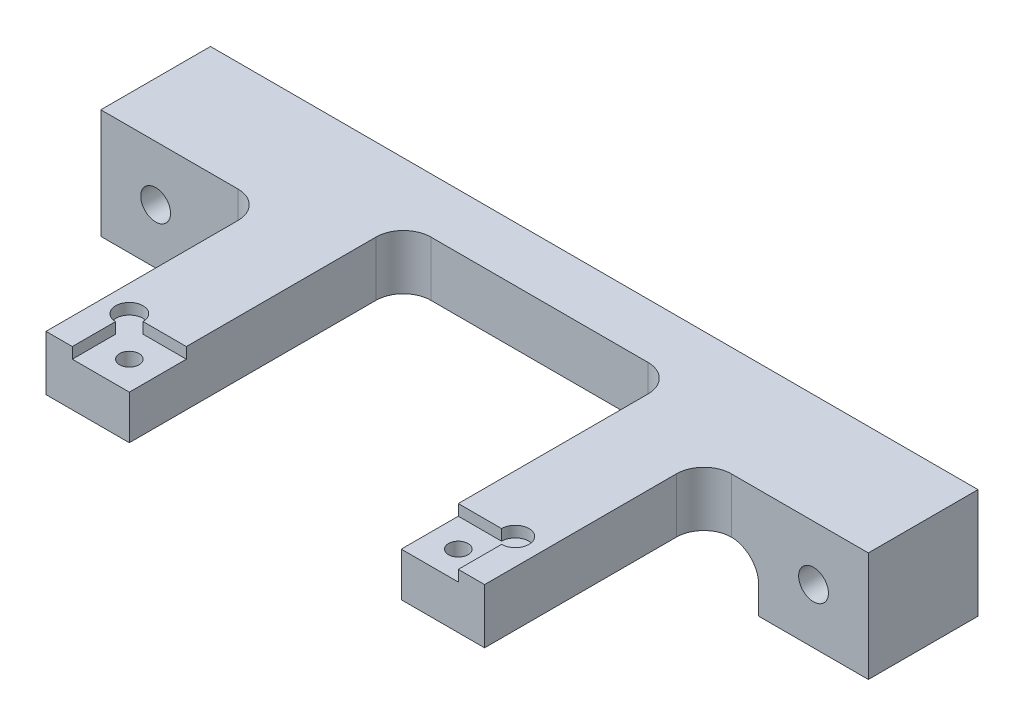
ISO-10303-21;
HEADER;
FILE_DESCRIPTION(('STEP AP214'),'2;1');
FILE_NAME('part.step','',(''),(''),'','','');
FILE_SCHEMA(('AUTOMOTIVE_DESIGN { 1 0 10303 214 1 1 1 1 }'));
ENDSEC;
DATA;
#1=APPLICATION_CONTEXT('core data for automotive mechanical design processes');
#2=APPLICATION_PROTOCOL_DEFINITION('international standard','automotive_design',2000,#1);
#3=PRODUCT_CONTEXT('',#1,'mechanical');
#4=PRODUCT('Part','Part','',(#3));
#5=PRODUCT_RELATED_PRODUCT_CATEGORY('part','',(#4));
#6=PRODUCT_DEFINITION_FORMATION('','',#4);
#7=PRODUCT_DEFINITION_CONTEXT('part definition',#1,'design');
#8=PRODUCT_DEFINITION('design','',#6,#7);
#9=PRODUCT_DEFINITION_SHAPE('','',#8);
#10=(LENGTH_UNIT() NAMED_UNIT(*) SI_UNIT(.MILLI.,.METRE.));
#11=(NAMED_UNIT(*) PLANE_ANGLE_UNIT() SI_UNIT($,.RADIAN.));
#12=(NAMED_UNIT(*) SI_UNIT($,.STERADIAN.) SOLID_ANGLE_UNIT());
#13=UNCERTAINTY_MEASURE_WITH_UNIT(LENGTH_MEASURE(1.E-05),#10,'distance_accuracy_value','');
#14=(GEOMETRIC_REPRESENTATION_CONTEXT(3) GLOBAL_UNCERTAINTY_ASSIGNED_CONTEXT((#13)) GLOBAL_UNIT_ASSIGNED_CONTEXT((#10,
#11,#12)) REPRESENTATION_CONTEXT('',''));
#15=CARTESIAN_POINT('',(0.,0.,0.));
#16=DIRECTION('',(0.,0.,1.));
#17=DIRECTION('',(1.,0.,0.));
#18=AXIS2_PLACEMENT_3D('',#15,#16,#17);
#19=CARTESIAN_POINT('',(-44.45,-12.7,19.05));
#20=DIRECTION('',(0.,0.,1.));
#21=DIRECTION('',(1.,0.,0.));
#22=AXIS2_PLACEMENT_3D('',#19,#20,#21);
#23=PLANE('',#22);
#24=DIRECTION('',(0.,1.,0.));
#25=VECTOR('',#24,1.);
#26=CARTESIAN_POINT('',(-22.352,-1.27,19.05));
#27=LINE('',#26,#25);
#28=CARTESIAN_POINT('',(-22.352,-1.27,19.05));
#29=VERTEX_POINT('',#28);
#30=CARTESIAN_POINT('',(-22.352,0.,19.05));
#31=VERTEX_POINT('',#30);
#32=EDGE_CURVE('E502',#29,#31,#27,.T.);
#33=ORIENTED_EDGE('',*,*,#32,.T.);
#34=DIRECTION('',(1.,0.,0.));
#35=VECTOR('',#34,1.);
#36=CARTESIAN_POINT('',(-44.45,0.,19.05));
#37=LINE('',#36,#35);
#38=CARTESIAN_POINT('',(-25.4,0.,19.05));
#39=VERTEX_POINT('',#38);
#40=EDGE_CURVE('E268',#39,#31,#37,.T.);
#41=ORIENTED_EDGE('',*,*,#40,.F.);
#42=DIRECTION('',(0.,1.,0.));
#43=VECTOR('',#42,1.);
#44=CARTESIAN_POINT('',(-25.4,-12.7,19.05));
#45=LINE('',#44,#43);
#46=CARTESIAN_POINT('',(-25.4,-6.35,19.05));
#47=VERTEX_POINT('',#46);
#48=EDGE_CURVE('E371',#47,#39,#45,.T.);
#49=ORIENTED_EDGE('',*,*,#48,.F.);
#50=DIRECTION('',(-1.,0.,0.));
#51=VECTOR('',#50,1.);
#52=CARTESIAN_POINT('',(-25.4,-6.35,19.05));
#53=LINE('',#52,#51);
#54=CARTESIAN_POINT('',(-15.748,-6.35,19.05));
#55=VERTEX_POINT('',#54);
#56=EDGE_CURVE('E510',#55,#47,#53,.T.);
#57=ORIENTED_EDGE('',*,*,#56,.F.);
#58=DIRECTION('',(0.,1.,0.));
#59=VECTOR('',#58,1.);
#60=CARTESIAN_POINT('',(-15.748,-12.7,19.05));
#61=LINE('',#60,#59);
#62=CARTESIAN_POINT('',(-15.748,-1.27,19.05));
#63=VERTEX_POINT('',#62);
#64=EDGE_CURVE('E526',#55,#63,#61,.T.);
#65=ORIENTED_EDGE('',*,*,#64,.T.);
#66=DIRECTION('',(1.,0.,0.));
#67=VECTOR('',#66,1.);
#68=CARTESIAN_POINT('',(-15.748,-1.27,19.05));
#69=LINE('',#68,#67);
#70=EDGE_CURVE('E496',#29,#63,#69,.T.);
#71=ORIENTED_EDGE('',*,*,#70,.F.);
#72=EDGE_LOOP('',(#33,#41,#49,#57,#65,#71));
#73=FACE_BOUND('',#72,.T.);
#74=ADVANCED_FACE('F39',(#73),#23,.T.);
#75=DIRECTION('',(0.,1.,0.));
#76=VECTOR('',#75,1.);
#77=CARTESIAN_POINT('',(22.352,-1.27,19.05));
#78=LINE('',#77,#76);
#79=CARTESIAN_POINT('',(22.352,-1.27,19.05));
#80=VERTEX_POINT('',#79);
#81=CARTESIAN_POINT('',(22.352,0.,19.05));
#82=VERTEX_POINT('',#81);
#83=EDGE_CURVE('E478',#80,#82,#78,.T.);
#84=ORIENTED_EDGE('',*,*,#83,.F.);
#85=DIRECTION('',(1.,0.,0.));
#86=VECTOR('',#85,1.);
#87=CARTESIAN_POINT('',(15.748,-1.27,19.05));
#88=LINE('',#87,#86);
#89=CARTESIAN_POINT('',(15.748,-1.27,19.05));
#90=VERTEX_POINT('',#89);
#91=EDGE_CURVE('E469',#90,#80,#88,.T.);
#92=ORIENTED_EDGE('',*,*,#91,.F.);
#93=DIRECTION('',(0.,1.,0.));
#94=VECTOR('',#93,1.);
#95=CARTESIAN_POINT('',(15.748,-12.7,19.05));
#96=LINE('',#95,#94);
#97=CARTESIAN_POINT('',(15.748,-6.35,19.05));
#98=VERTEX_POINT('',#97);
#99=EDGE_CURVE('E362',#98,#90,#96,.T.);
#100=ORIENTED_EDGE('',*,*,#99,.F.);
#101=CARTESIAN_POINT('',(25.4,-6.35,19.05));
#102=VERTEX_POINT('',#101);
#103=EDGE_CURVE('E511',#102,#98,#53,.T.);
#104=ORIENTED_EDGE('',*,*,#103,.F.);
#105=DIRECTION('',(0.,1.,0.));
#106=VECTOR('',#105,1.);
#107=CARTESIAN_POINT('',(25.4,-12.7,19.05));
#108=LINE('',#107,#106);
#109=CARTESIAN_POINT('',(25.4,0.,19.05));
#110=VERTEX_POINT('',#109);
#111=EDGE_CURVE('E365',#102,#110,#108,.T.);
#112=ORIENTED_EDGE('',*,*,#111,.T.);
#113=EDGE_CURVE('E266',#82,#110,#37,.T.);
#114=ORIENTED_EDGE('',*,*,#113,.F.);
#115=EDGE_LOOP('',(#84,#92,#100,#104,#112,#114));
#116=FACE_BOUND('',#115,.T.);
#117=ADVANCED_FACE('F570',(#116),#23,.T.);
#118=CARTESIAN_POINT('',(0.,-12.7,0.));
#119=DIRECTION('',(0.,1.,0.));
#120=DIRECTION('',(0.,0.,1.));
#121=AXIS2_PLACEMENT_3D('',#118,#119,#120);
#122=PLANE('',#121);
#123=DIRECTION('',(-1.,0.,0.));
#124=VECTOR('',#123,1.);
#125=CARTESIAN_POINT('',(-44.45,-12.7,-19.05));
#126=LINE('',#125,#124);
#127=CARTESIAN_POINT('',(-31.75,-12.7,-19.05));
#128=VERTEX_POINT('',#127);
#129=CARTESIAN_POINT('',(-44.45,-12.7,-19.05));
#130=VERTEX_POINT('',#129);
#131=EDGE_CURVE('E255',#128,#130,#126,.T.);
#132=ORIENTED_EDGE('',*,*,#131,.F.);
#133=DIRECTION('',(0.,0.,-1.));
#134=VECTOR('',#133,1.);
#135=CARTESIAN_POINT('',(-31.75,-12.7,-19.05));
#136=LINE('',#135,#134);
#137=CARTESIAN_POINT('',(-31.75,-12.7,-6.35));
#138=VERTEX_POINT('',#137);
#139=EDGE_CURVE('E420',#138,#128,#136,.T.);
#140=ORIENTED_EDGE('',*,*,#139,.F.);
#141=DIRECTION('',(-1.,0.,0.));
#142=VECTOR('',#141,1.);
#143=CARTESIAN_POINT('',(-44.45,-12.7,-6.35000000000001));
#144=LINE('',#143,#142);
#145=CARTESIAN_POINT('',(-44.45,-12.7,-6.35000000000001));
#146=VERTEX_POINT('',#145);
#147=EDGE_CURVE('E369',#138,#146,#144,.T.);
#148=ORIENTED_EDGE('',*,*,#147,.T.);
#149=DIRECTION('',(0.,0.,1.));
#150=VECTOR('',#149,1.);
#151=CARTESIAN_POINT('',(-44.45,-12.7,-19.05));
#152=LINE('',#151,#150);
#153=EDGE_CURVE('E276',#130,#146,#152,.T.);
#154=ORIENTED_EDGE('',*,*,#153,.F.);
#155=EDGE_LOOP('',(#132,#140,#148,#154));
#156=FACE_BOUND('',#155,.T.);
#157=ADVANCED_FACE('F575',(#156),#122,.F.);
#158=CARTESIAN_POINT('',(-25.4,-12.7,19.05));
#159=DIRECTION('',(1.,0.,0.));
#160=DIRECTION('',(0.,0.,-1.));
#161=AXIS2_PLACEMENT_3D('',#158,#159,#160);
#162=PLANE('',#161);
#163=DIRECTION('',(0.,0.,-1.));
#164=VECTOR('',#163,1.);
#165=CARTESIAN_POINT('',(-25.4,0.,19.05));
#166=LINE('',#165,#164);
#167=CARTESIAN_POINT('',(-25.4,0.,-3.17500000000001));
#168=VERTEX_POINT('',#167);
#169=EDGE_CURVE('E367',#39,#168,#166,.T.);
#170=ORIENTED_EDGE('',*,*,#169,.T.);
#171=DIRECTION('',(0.,1.,0.));
#172=VECTOR('',#171,1.);
#173=CARTESIAN_POINT('',(-25.4,-6.35,-3.17500000000001));
#174=LINE('',#173,#172);
#175=CARTESIAN_POINT('',(-25.4,-6.35,-3.175));
#176=VERTEX_POINT('',#175);
#177=EDGE_CURVE('E325',#168,#176,#174,.F.);
#178=ORIENTED_EDGE('',*,*,#177,.T.);
#179=DIRECTION('',(0.,0.,-1.));
#180=VECTOR('',#179,1.);
#181=CARTESIAN_POINT('',(-25.4,-6.35,19.05));
#182=LINE('',#181,#180);
#183=EDGE_CURVE('E408',#47,#176,#182,.T.);
#184=ORIENTED_EDGE('',*,*,#183,.F.);
#185=ORIENTED_EDGE('',*,*,#48,.T.);
#186=EDGE_LOOP('',(#170,#178,#184,#185));
#187=FACE_BOUND('',#186,.T.);
#188=ADVANCED_FACE('F401',(#187),#162,.F.);
#189=CARTESIAN_POINT('',(25.4,-12.7,19.05));
#190=DIRECTION('',(-1.,0.,0.));
#191=DIRECTION('',(0.,0.,1.));
#192=AXIS2_PLACEMENT_3D('',#189,#190,#191);
#193=PLANE('',#192);
#194=DIRECTION('',(0.,0.,1.));
#195=VECTOR('',#194,1.);
#196=CARTESIAN_POINT('',(25.4,-6.35,19.05));
#197=LINE('',#196,#195);
#198=CARTESIAN_POINT('',(25.4,-6.35,-3.175));
#199=VERTEX_POINT('',#198);
#200=EDGE_CURVE('E353',#199,#102,#197,.T.);
#201=ORIENTED_EDGE('',*,*,#200,.F.);
#202=DIRECTION('',(0.,1.,0.));
#203=VECTOR('',#202,1.);
#204=CARTESIAN_POINT('',(25.4,0.,-3.175));
#205=LINE('',#204,#203);
#206=CARTESIAN_POINT('',(25.4,0.,-3.175));
#207=VERTEX_POINT('',#206);
#208=EDGE_CURVE('E331',#199,#207,#205,.T.);
#209=ORIENTED_EDGE('',*,*,#208,.T.);
#210=DIRECTION('',(0.,0.,1.));
#211=VECTOR('',#210,1.);
#212=CARTESIAN_POINT('',(25.4,0.,19.05));
#213=LINE('',#212,#211);
#214=EDGE_CURVE('E351',#207,#110,#213,.T.);
#215=ORIENTED_EDGE('',*,*,#214,.T.);
#216=ORIENTED_EDGE('',*,*,#111,.F.);
#217=EDGE_LOOP('',(#201,#209,#215,#216));
#218=FACE_BOUND('',#217,.T.);
#219=ADVANCED_FACE('F349',(#218),#193,.F.);
#220=CARTESIAN_POINT('',(-15.748,-12.7,-12.7));
#221=DIRECTION('',(-1.,0.,0.));
#222=DIRECTION('',(0.,0.,1.));
#223=AXIS2_PLACEMENT_3D('',#220,#221,#222);
#224=PLANE('',#223);
#225=DIRECTION('',(0.,0.,1.));
#226=VECTOR('',#225,1.);
#227=CARTESIAN_POINT('',(-15.748,-6.35,-12.7));
#228=LINE('',#227,#226);
#229=CARTESIAN_POINT('',(-15.748,-6.35,-9.52500000000001));
#230=VERTEX_POINT('',#229);
#231=EDGE_CURVE('E516',#230,#55,#228,.T.);
#232=ORIENTED_EDGE('',*,*,#231,.F.);
#233=DIRECTION('',(0.,1.,0.));
#234=VECTOR('',#233,1.);
#235=CARTESIAN_POINT('',(-15.748,0.,-9.52500000000001));
#236=LINE('',#235,#234);
#237=CARTESIAN_POINT('',(-15.748,0.,-9.52500000000001));
#238=VERTEX_POINT('',#237);
#239=EDGE_CURVE('E281',#230,#238,#236,.T.);
#240=ORIENTED_EDGE('',*,*,#239,.T.);
#241=DIRECTION('',(0.,0.,1.));
#242=VECTOR('',#241,1.);
#243=CARTESIAN_POINT('',(-15.748,0.,-12.7));
#244=LINE('',#243,#242);
#245=CARTESIAN_POINT('',(-15.748,0.,12.446));
#246=VERTEX_POINT('',#245);
#247=EDGE_CURVE('E518',#238,#246,#244,.T.);
#248=ORIENTED_EDGE('',*,*,#247,.T.);
#249=DIRECTION('',(0.,1.,0.));
#250=VECTOR('',#249,1.);
#251=CARTESIAN_POINT('',(-15.748,-1.27,12.446));
#252=LINE('',#251,#250);
#253=CARTESIAN_POINT('',(-15.748,-1.27,12.446));
#254=VERTEX_POINT('',#253);
#255=EDGE_CURVE('E498',#254,#246,#252,.T.);
#256=ORIENTED_EDGE('',*,*,#255,.F.);
#257=DIRECTION('',(0.,0.,-1.));
#258=VECTOR('',#257,1.);
#259=CARTESIAN_POINT('',(-15.748,-1.27,19.05));
#260=LINE('',#259,#258);
#261=EDGE_CURVE('E487',#63,#254,#260,.T.);
#262=ORIENTED_EDGE('',*,*,#261,.F.);
#263=ORIENTED_EDGE('',*,*,#64,.F.);
#264=EDGE_LOOP('',(#232,#240,#248,#256,#262,#263));
#265=FACE_BOUND('',#264,.T.);
#266=ADVANCED_FACE('F537',(#265),#224,.F.);
#267=CARTESIAN_POINT('',(-15.748,-12.7,-12.7));
#268=DIRECTION('',(0.,0.,-1.));
#269=DIRECTION('',(-1.,0.,0.));
#270=AXIS2_PLACEMENT_3D('',#267,#268,#269);
#271=PLANE('',#270);
#272=DIRECTION('',(-1.,0.,0.));
#273=VECTOR('',#272,1.);
#274=CARTESIAN_POINT('',(-15.748,0.,-12.7));
#275=LINE('',#274,#273);
#276=CARTESIAN_POINT('',(12.573,0.,-12.7));
#277=VERTEX_POINT('',#276);
#278=CARTESIAN_POINT('',(-12.573,0.,-12.7));
#279=VERTEX_POINT('',#278);
#280=EDGE_CURVE('E523',#277,#279,#275,.T.);
#281=ORIENTED_EDGE('',*,*,#280,.T.);
#282=DIRECTION('',(0.,1.,0.));
#283=VECTOR('',#282,1.);
#284=CARTESIAN_POINT('',(-12.573,-6.35,-12.7));
#285=LINE('',#284,#283);
#286=CARTESIAN_POINT('',(-12.573,-6.35,-12.7));
#287=VERTEX_POINT('',#286);
#288=EDGE_CURVE('E292',#279,#287,#285,.F.);
#289=ORIENTED_EDGE('',*,*,#288,.T.);
#290=DIRECTION('',(-1.,0.,0.));
#291=VECTOR('',#290,1.);
#292=CARTESIAN_POINT('',(-15.748,-6.35,-12.7));
#293=LINE('',#292,#291);
#294=CARTESIAN_POINT('',(12.573,-6.35,-12.7));
#295=VERTEX_POINT('',#294);
#296=EDGE_CURVE('E513',#295,#287,#293,.T.);
#297=ORIENTED_EDGE('',*,*,#296,.F.);
#298=DIRECTION('',(0.,1.,0.));
#299=VECTOR('',#298,1.);
#300=CARTESIAN_POINT('',(12.573,0.,-12.7));
#301=LINE('',#300,#299);
#302=EDGE_CURVE('E289',#295,#277,#301,.T.);
#303=ORIENTED_EDGE('',*,*,#302,.T.);
#304=EDGE_LOOP('',(#281,#289,#297,#303));
#305=FACE_BOUND('',#304,.T.);
#306=ADVANCED_FACE('F735',(#305),#271,.F.);
#307=CARTESIAN_POINT('',(15.748,-12.7,-12.7));
#308=DIRECTION('',(1.,0.,0.));
#309=DIRECTION('',(0.,0.,-1.));
#310=AXIS2_PLACEMENT_3D('',#307,#308,#309);
#311=PLANE('',#310);
#312=DIRECTION('',(0.,0.,-1.));
#313=VECTOR('',#312,1.);
#314=CARTESIAN_POINT('',(15.748,0.,-12.7));
#315=LINE('',#314,#313);
#316=CARTESIAN_POINT('',(15.748,0.,12.446));
#317=VERTEX_POINT('',#316);
#318=CARTESIAN_POINT('',(15.748,0.,-9.52500000000001));
#319=VERTEX_POINT('',#318);
#320=EDGE_CURVE('E520',#317,#319,#315,.T.);
#321=ORIENTED_EDGE('',*,*,#320,.T.);
#322=DIRECTION('',(0.,1.,0.));
#323=VECTOR('',#322,1.);
#324=CARTESIAN_POINT('',(15.748,-6.35,-9.52500000000001));
#325=LINE('',#324,#323);
#326=CARTESIAN_POINT('',(15.748,-6.35,-9.52500000000001));
#327=VERTEX_POINT('',#326);
#328=EDGE_CURVE('E294',#319,#327,#325,.F.);
#329=ORIENTED_EDGE('',*,*,#328,.T.);
#330=DIRECTION('',(0.,0.,-1.));
#331=VECTOR('',#330,1.);
#332=CARTESIAN_POINT('',(15.748,-6.35,-12.7));
#333=LINE('',#332,#331);
#334=EDGE_CURVE('E277',#98,#327,#333,.T.);
#335=ORIENTED_EDGE('',*,*,#334,.F.);
#336=ORIENTED_EDGE('',*,*,#99,.T.);
#337=DIRECTION('',(0.,0.,1.));
#338=VECTOR('',#337,1.);
#339=CARTESIAN_POINT('',(15.748,-1.27,19.05));
#340=LINE('',#339,#338);
#341=CARTESIAN_POINT('',(15.748,-1.27,12.446));
#342=VERTEX_POINT('',#341);
#343=EDGE_CURVE('E467',#342,#90,#340,.T.);
#344=ORIENTED_EDGE('',*,*,#343,.F.);
#345=DIRECTION('',(0.,1.,0.));
#346=VECTOR('',#345,1.);
#347=CARTESIAN_POINT('',(15.748,-1.27,12.446));
#348=LINE('',#347,#346);
#349=EDGE_CURVE('E482',#342,#317,#348,.T.);
#350=ORIENTED_EDGE('',*,*,#349,.T.);
#351=EDGE_LOOP('',(#321,#329,#335,#336,#344,#350));
#352=FACE_BOUND('',#351,.T.);
#353=ADVANCED_FACE('F582',(#352),#311,.F.);
#354=CARTESIAN_POINT('',(-44.45,-12.7,-19.05));
#355=DIRECTION('',(-1.,0.,0.));
#356=DIRECTION('',(0.,0.,1.));
#357=AXIS2_PLACEMENT_3D('',#354,#355,#356);
#358=PLANE('',#357);
#359=DIRECTION('',(0.,1.,0.));
#360=VECTOR('',#359,1.);
#361=CARTESIAN_POINT('',(-44.45,-12.7,-6.35000000000001));
#362=LINE('',#361,#360);
#363=CARTESIAN_POINT('',(-44.45,0.,-6.35000000000001));
#364=VERTEX_POINT('',#363);
#365=EDGE_CURVE('E267',#146,#364,#362,.T.);
#366=ORIENTED_EDGE('',*,*,#365,.T.);
#367=DIRECTION('',(0.,0.,1.));
#368=VECTOR('',#367,1.);
#369=CARTESIAN_POINT('',(-44.45,0.,-19.05));
#370=LINE('',#369,#368);
#371=CARTESIAN_POINT('',(-44.45,0.,-19.05));
#372=VERTEX_POINT('',#371);
#373=EDGE_CURVE('E263',#372,#364,#370,.T.);
#374=ORIENTED_EDGE('',*,*,#373,.F.);
#375=DIRECTION('',(0.,1.,0.));
#376=VECTOR('',#375,1.);
#377=CARTESIAN_POINT('',(-44.45,-12.7,-19.05));
#378=LINE('',#377,#376);
#379=EDGE_CURVE('E257',#130,#372,#378,.T.);
#380=ORIENTED_EDGE('',*,*,#379,.F.);
#381=ORIENTED_EDGE('',*,*,#153,.T.);
#382=EDGE_LOOP('',(#366,#374,#380,#381));
#383=FACE_BOUND('',#382,.T.);
#384=ADVANCED_FACE('F389',(#383),#358,.T.);
#385=CARTESIAN_POINT('',(-44.45,-12.7,-19.05));
#386=DIRECTION('',(0.,0.,-1.));
#387=DIRECTION('',(-1.,0.,0.));
#388=AXIS2_PLACEMENT_3D('',#385,#386,#387);
#389=PLANE('',#388);
#390=DIRECTION('',(0.,-1.,0.));
#391=VECTOR('',#390,1.);
#392=CARTESIAN_POINT('',(31.75,-6.35,-19.05));
#393=LINE('',#392,#391);
#394=CARTESIAN_POINT('',(31.75,-9.525,-19.05));
#395=VERTEX_POINT('',#394);
#396=CARTESIAN_POINT('',(31.75,-12.7,-19.05));
#397=VERTEX_POINT('',#396);
#398=EDGE_CURVE('E229',#395,#397,#393,.T.);
#399=ORIENTED_EDGE('',*,*,#398,.F.);
#400=CARTESIAN_POINT('',(28.575,-9.525,-19.05));
#401=DIRECTION('',(0.,0.,-1.));
#402=DIRECTION('',(-1.,0.,0.));
#403=AXIS2_PLACEMENT_3D('',#400,#401,#402);
#404=CIRCLE('',#403,3.175);
#405=CARTESIAN_POINT('',(28.575,-6.35,-19.05));
#406=VERTEX_POINT('',#405);
#407=EDGE_CURVE('E320',#395,#406,#404,.F.);
#408=ORIENTED_EDGE('',*,*,#407,.T.);
#409=DIRECTION('',(1.,0.,0.));
#410=VECTOR('',#409,1.);
#411=CARTESIAN_POINT('',(-25.4,-6.35,-19.05));
#412=LINE('',#411,#410);
#413=CARTESIAN_POINT('',(-28.575,-6.35,-19.05));
#414=VERTEX_POINT('',#413);
#415=EDGE_CURVE('E347',#414,#406,#412,.T.);
#416=ORIENTED_EDGE('',*,*,#415,.F.);
#417=CARTESIAN_POINT('',(-28.575,-9.525,-19.05));
#418=DIRECTION('',(0.,0.,-1.));
#419=DIRECTION('',(-1.,0.,0.));
#420=AXIS2_PLACEMENT_3D('',#417,#418,#419);
#421=CIRCLE('',#420,3.175);
#422=CARTESIAN_POINT('',(-31.75,-9.525,-19.05));
#423=VERTEX_POINT('',#422);
#424=EDGE_CURVE('E309',#414,#423,#421,.F.);
#425=ORIENTED_EDGE('',*,*,#424,.T.);
#426=DIRECTION('',(0.,-1.,0.));
#427=VECTOR('',#426,1.);
#428=CARTESIAN_POINT('',(-31.75,-6.35,-19.05));
#429=LINE('',#428,#427);
#430=EDGE_CURVE('E415',#423,#128,#429,.T.);
#431=ORIENTED_EDGE('',*,*,#430,.T.);
#432=ORIENTED_EDGE('',*,*,#131,.T.);
#433=ORIENTED_EDGE('',*,*,#379,.T.);
#434=DIRECTION('',(-1.,0.,0.));
#435=VECTOR('',#434,1.);
#436=CARTESIAN_POINT('',(-44.45,0.,-19.05));
#437=LINE('',#436,#435);
#438=CARTESIAN_POINT('',(44.45,0.,-19.05));
#439=VERTEX_POINT('',#438);
#440=EDGE_CURVE('E273',#439,#372,#437,.T.);
#441=ORIENTED_EDGE('',*,*,#440,.F.);
#442=DIRECTION('',(0.,1.,0.));
#443=VECTOR('',#442,1.);
#444=CARTESIAN_POINT('',(44.45,-12.7,-19.05));
#445=LINE('',#444,#443);
#446=CARTESIAN_POINT('',(44.45,-12.7,-19.05));
#447=VERTEX_POINT('',#446);
#448=EDGE_CURVE('E254',#447,#439,#445,.T.);
#449=ORIENTED_EDGE('',*,*,#448,.F.);
#450=EDGE_CURVE('E246',#447,#397,#126,.T.);
#451=ORIENTED_EDGE('',*,*,#450,.T.);
#452=EDGE_LOOP('',(#399,#408,#416,#425,#431,#432,#433,#441,#449,#451));
#453=FACE_BOUND('',#452,.T.);
#454=CARTESIAN_POINT('',(-38.1,-6.35,-19.05));
#455=DIRECTION('',(0.,0.,1.));
#456=DIRECTION('',(1.,0.,0.));
#457=AXIS2_PLACEMENT_3D('',#454,#455,#456);
#458=CIRCLE('',#457,1.7272);
#459=CARTESIAN_POINT('',(-36.3728,-6.35,-19.05));
#460=VERTEX_POINT('',#459);
#461=EDGE_CURVE('E450',#460,#460,#458,.T.);
#462=ORIENTED_EDGE('',*,*,#461,.T.);
#463=EDGE_LOOP('',(#462));
#464=FACE_BOUND('',#463,.T.);
#465=CARTESIAN_POINT('',(38.1,-6.35,-19.05));
#466=DIRECTION('',(0.,0.,1.));
#467=DIRECTION('',(1.,0.,0.));
#468=AXIS2_PLACEMENT_3D('',#465,#466,#467);
#469=CIRCLE('',#468,1.7272);
#470=CARTESIAN_POINT('',(39.8272,-6.35,-19.05));
#471=VERTEX_POINT('',#470);
#472=EDGE_CURVE('E456',#471,#471,#469,.T.);
#473=ORIENTED_EDGE('',*,*,#472,.T.);
#474=EDGE_LOOP('',(#473));
#475=FACE_BOUND('',#474,.T.);
#476=ADVANCED_FACE('F250',(#453,#464,#475),#389,.T.);
#477=CARTESIAN_POINT('',(44.45,-12.7,-19.05));
#478=DIRECTION('',(1.,0.,0.));
#479=DIRECTION('',(0.,0.,-1.));
#480=AXIS2_PLACEMENT_3D('',#477,#478,#479);
#481=PLANE('',#480);
#482=DIRECTION('',(0.,1.,0.));
#483=VECTOR('',#482,1.);
#484=CARTESIAN_POINT('',(44.45,-12.7,-6.35000000000001));
#485=LINE('',#484,#483);
#486=CARTESIAN_POINT('',(44.45,-12.7,-6.35000000000001));
#487=VERTEX_POINT('',#486);
#488=CARTESIAN_POINT('',(44.45,0.,-6.35000000000001));
#489=VERTEX_POINT('',#488);
#490=EDGE_CURVE('E360',#487,#489,#485,.T.);
#491=ORIENTED_EDGE('',*,*,#490,.F.);
#492=DIRECTION('',(0.,0.,-1.));
#493=VECTOR('',#492,1.);
#494=CARTESIAN_POINT('',(44.45,-12.7,-19.05));
#495=LINE('',#494,#493);
#496=EDGE_CURVE('E259',#487,#447,#495,.T.);
#497=ORIENTED_EDGE('',*,*,#496,.T.);
#498=ORIENTED_EDGE('',*,*,#448,.T.);
#499=DIRECTION('',(0.,0.,-1.));
#500=VECTOR('',#499,1.);
#501=CARTESIAN_POINT('',(44.45,0.,-19.05));
#502=LINE('',#501,#500);
#503=EDGE_CURVE('E271',#489,#439,#502,.T.);
#504=ORIENTED_EDGE('',*,*,#503,.F.);
#505=EDGE_LOOP('',(#491,#497,#498,#504));
#506=FACE_BOUND('',#505,.T.);
#507=ADVANCED_FACE('F384',(#506),#481,.T.);
#508=DIRECTION('',(-1.,0.,0.));
#509=VECTOR('',#508,1.);
#510=CARTESIAN_POINT('',(44.45,-12.7,-6.35000000000001));
#511=LINE('',#510,#509);
#512=CARTESIAN_POINT('',(31.75,-12.7,-6.35000000000001));
#513=VERTEX_POINT('',#512);
#514=EDGE_CURVE('E247',#487,#513,#511,.T.);
#515=ORIENTED_EDGE('',*,*,#514,.T.);
#516=DIRECTION('',(0.,0.,1.));
#517=VECTOR('',#516,1.);
#518=CARTESIAN_POINT('',(31.75,-12.7,-19.05));
#519=LINE('',#518,#517);
#520=EDGE_CURVE('E233',#397,#513,#519,.T.);
#521=ORIENTED_EDGE('',*,*,#520,.F.);
#522=ORIENTED_EDGE('',*,*,#450,.F.);
#523=ORIENTED_EDGE('',*,*,#496,.F.);
#524=EDGE_LOOP('',(#515,#521,#522,#523));
#525=FACE_BOUND('',#524,.T.);
#526=ADVANCED_FACE('F244',(#525),#122,.F.);
#527=CARTESIAN_POINT('',(0.,0.,0.));
#528=DIRECTION('',(0.,1.,0.));
#529=DIRECTION('',(0.,0.,1.));
#530=AXIS2_PLACEMENT_3D('',#527,#528,#529);
#531=PLANE('',#530);
#532=CARTESIAN_POINT('',(22.352,0.,12.446));
#533=DIRECTION('',(0.,1.,0.));
#534=DIRECTION('',(0.,0.,1.));
#535=AXIS2_PLACEMENT_3D('',#532,#533,#534);
#536=CIRCLE('',#535,1.5875);
#537=CARTESIAN_POINT('',(22.352,0.,14.0335));
#538=VERTEX_POINT('',#537);
#539=CARTESIAN_POINT('',(20.7645,0.,12.446));
#540=VERTEX_POINT('',#539);
#541=EDGE_CURVE('E421',#538,#540,#536,.T.);
#542=ORIENTED_EDGE('',*,*,#541,.F.);
#543=DIRECTION('',(0.,0.,-1.));
#544=VECTOR('',#543,1.);
#545=CARTESIAN_POINT('',(22.352,0.,19.05));
#546=LINE('',#545,#544);
#547=EDGE_CURVE('E466',#82,#538,#546,.T.);
#548=ORIENTED_EDGE('',*,*,#547,.F.);
#549=ORIENTED_EDGE('',*,*,#113,.T.);
#550=ORIENTED_EDGE('',*,*,#214,.F.);
#551=CARTESIAN_POINT('',(28.575,0.,-3.175));
#552=DIRECTION('',(0.,1.,0.));
#553=DIRECTION('',(0.,0.,1.));
#554=AXIS2_PLACEMENT_3D('',#551,#552,#553);
#555=CIRCLE('',#554,3.175);
#556=CARTESIAN_POINT('',(28.575,0.,-6.35000000000001));
#557=VERTEX_POINT('',#556);
#558=EDGE_CURVE('E47',#207,#557,#555,.F.);
#559=ORIENTED_EDGE('',*,*,#558,.T.);
#560=DIRECTION('',(-1.,0.,0.));
#561=VECTOR('',#560,1.);
#562=CARTESIAN_POINT('',(44.45,0.,-6.35000000000001));
#563=LINE('',#562,#561);
#564=EDGE_CURVE('E337',#489,#557,#563,.T.);
#565=ORIENTED_EDGE('',*,*,#564,.F.);
#566=ORIENTED_EDGE('',*,*,#503,.T.);
#567=ORIENTED_EDGE('',*,*,#440,.T.);
#568=ORIENTED_EDGE('',*,*,#373,.T.);
#569=DIRECTION('',(-1.,0.,0.));
#570=VECTOR('',#569,1.);
#571=CARTESIAN_POINT('',(-44.45,0.,-6.35000000000001));
#572=LINE('',#571,#570);
#573=CARTESIAN_POINT('',(-28.575,0.,-6.35000000000001));
#574=VERTEX_POINT('',#573);
#575=EDGE_CURVE('E372',#574,#364,#572,.T.);
#576=ORIENTED_EDGE('',*,*,#575,.F.);
#577=CARTESIAN_POINT('',(-28.575,0.,-3.17500000000001));
#578=DIRECTION('',(0.,1.,0.));
#579=DIRECTION('',(0.,0.,1.));
#580=AXIS2_PLACEMENT_3D('',#577,#578,#579);
#581=CIRCLE('',#580,3.175);
#582=EDGE_CURVE('E327',#574,#168,#581,.F.);
#583=ORIENTED_EDGE('',*,*,#582,.T.);
#584=ORIENTED_EDGE('',*,*,#169,.F.);
#585=ORIENTED_EDGE('',*,*,#40,.T.);
#586=DIRECTION('',(0.,0.,1.));
#587=VECTOR('',#586,1.);
#588=CARTESIAN_POINT('',(-22.352,0.,19.05));
#589=LINE('',#588,#587);
#590=CARTESIAN_POINT('',(-22.352,0.,14.0335));
#591=VERTEX_POINT('',#590);
#592=EDGE_CURVE('E491',#591,#31,#589,.T.);
#593=ORIENTED_EDGE('',*,*,#592,.F.);
#594=CARTESIAN_POINT('',(-22.352,0.,12.446));
#595=DIRECTION('',(0.,1.,0.));
#596=DIRECTION('',(0.,0.,1.));
#597=AXIS2_PLACEMENT_3D('',#594,#595,#596);
#598=CIRCLE('',#597,1.5875);
#599=CARTESIAN_POINT('',(-20.7645,0.,12.446));
#600=VERTEX_POINT('',#599);
#601=EDGE_CURVE('E436',#600,#591,#598,.T.);
#602=ORIENTED_EDGE('',*,*,#601,.F.);
#603=DIRECTION('',(-1.,0.,0.));
#604=VECTOR('',#603,1.);
#605=CARTESIAN_POINT('',(-15.748,0.,12.446));
#606=LINE('',#605,#604);
#607=EDGE_CURVE('E485',#246,#600,#606,.T.);
#608=ORIENTED_EDGE('',*,*,#607,.F.);
#609=ORIENTED_EDGE('',*,*,#247,.F.);
#610=CARTESIAN_POINT('',(-12.573,0.,-9.52500000000001));
#611=DIRECTION('',(0.,1.,0.));
#612=DIRECTION('',(0.,0.,1.));
#613=AXIS2_PLACEMENT_3D('',#610,#611,#612);
#614=CIRCLE('',#613,3.175);
#615=EDGE_CURVE('E296',#238,#279,#614,.F.);
#616=ORIENTED_EDGE('',*,*,#615,.T.);
#617=ORIENTED_EDGE('',*,*,#280,.F.);
#618=CARTESIAN_POINT('',(12.573,0.,-9.52500000000001));
#619=DIRECTION('',(0.,1.,0.));
#620=DIRECTION('',(0.,0.,1.));
#621=AXIS2_PLACEMENT_3D('',#618,#619,#620);
#622=CIRCLE('',#621,3.175);
#623=EDGE_CURVE('E300',#277,#319,#622,.F.);
#624=ORIENTED_EDGE('',*,*,#623,.T.);
#625=ORIENTED_EDGE('',*,*,#320,.F.);
#626=DIRECTION('',(-1.,0.,0.));
#627=VECTOR('',#626,1.);
#628=CARTESIAN_POINT('',(15.748,0.,12.446));
#629=LINE('',#628,#627);
#630=EDGE_CURVE('E470',#540,#317,#629,.T.);
#631=ORIENTED_EDGE('',*,*,#630,.F.);
#632=EDGE_LOOP('',(#542,#548,#549,#550,#559,#565,#566,#567,#568,#576,#583,#584,#585,#593,#602,
#608,#609,#616,#617,#624,#625,#631));
#633=FACE_BOUND('',#632,.T.);
#634=ADVANCED_FACE('F355',(#633),#531,.T.);
#635=CARTESIAN_POINT('',(-44.45,-12.7,-6.35000000000001));
#636=DIRECTION('',(0.,0.,-1.));
#637=DIRECTION('',(-1.,0.,0.));
#638=AXIS2_PLACEMENT_3D('',#635,#636,#637);
#639=PLANE('',#638);
#640=CARTESIAN_POINT('',(-38.1,-6.35,-6.35000000000001));
#641=DIRECTION('',(0.,0.,1.));
#642=DIRECTION('',(1.,0.,0.));
#643=AXIS2_PLACEMENT_3D('',#640,#641,#642);
#644=CIRCLE('',#643,1.72719999999999);
#645=CARTESIAN_POINT('',(-36.3728,-6.35,-6.35000000000001));
#646=VERTEX_POINT('',#645);
#647=EDGE_CURVE('E447',#646,#646,#644,.T.);
#648=ORIENTED_EDGE('',*,*,#647,.F.);
#649=EDGE_LOOP('',(#648));
#650=FACE_BOUND('',#649,.T.);
#651=CARTESIAN_POINT('',(-28.575,-9.525,-6.35000000000001));
#652=DIRECTION('',(0.,0.,-1.));
#653=DIRECTION('',(-1.,0.,0.));
#654=AXIS2_PLACEMENT_3D('',#651,#652,#653);
#655=CIRCLE('',#654,3.175);
#656=CARTESIAN_POINT('',(-31.75,-9.525,-6.35));
#657=VERTEX_POINT('',#656);
#658=CARTESIAN_POINT('',(-28.575,-6.35,-6.35));
#659=VERTEX_POINT('',#658);
#660=EDGE_CURVE('E311',#657,#659,#655,.T.);
#661=ORIENTED_EDGE('',*,*,#660,.T.);
#662=DIRECTION('',(0.,1.,0.));
#663=VECTOR('',#662,1.);
#664=CARTESIAN_POINT('',(-28.575,0.,-6.35000000000001));
#665=LINE('',#664,#663);
#666=EDGE_CURVE('E322',#659,#574,#665,.T.);
#667=ORIENTED_EDGE('',*,*,#666,.T.);
#668=ORIENTED_EDGE('',*,*,#575,.T.);
#669=ORIENTED_EDGE('',*,*,#365,.F.);
#670=ORIENTED_EDGE('',*,*,#147,.F.);
#671=DIRECTION('',(0.,-1.,0.));
#672=VECTOR('',#671,1.);
#673=CARTESIAN_POINT('',(-31.75,-6.35,-6.35));
#674=LINE('',#673,#672);
#675=EDGE_CURVE('E410',#657,#138,#674,.T.);
#676=ORIENTED_EDGE('',*,*,#675,.F.);
#677=EDGE_LOOP('',(#661,#667,#668,#669,#670,#676));
#678=FACE_BOUND('',#677,.T.);
#679=ADVANCED_FACE('F393',(#650,#678),#639,.F.);
#680=CARTESIAN_POINT('',(44.45,-12.7,-6.35000000000001));
#681=DIRECTION('',(0.,0.,-1.));
#682=DIRECTION('',(-1.,0.,0.));
#683=AXIS2_PLACEMENT_3D('',#680,#681,#682);
#684=PLANE('',#683);
#685=CARTESIAN_POINT('',(38.1,-6.35,-6.35000000000001));
#686=DIRECTION('',(0.,0.,1.));
#687=DIRECTION('',(1.,0.,0.));
#688=AXIS2_PLACEMENT_3D('',#685,#686,#687);
#689=CIRCLE('',#688,1.72719999999998);
#690=CARTESIAN_POINT('',(39.8272,-6.35,-6.35000000000001));
#691=VERTEX_POINT('',#690);
#692=EDGE_CURVE('E453',#691,#691,#689,.T.);
#693=ORIENTED_EDGE('',*,*,#692,.F.);
#694=EDGE_LOOP('',(#693));
#695=FACE_BOUND('',#694,.T.);
#696=ORIENTED_EDGE('',*,*,#564,.T.);
#697=DIRECTION('',(0.,1.,0.));
#698=VECTOR('',#697,1.);
#699=CARTESIAN_POINT('',(28.575,-6.35,-6.35000000000001));
#700=LINE('',#699,#698);
#701=CARTESIAN_POINT('',(28.575,-6.35,-6.35));
#702=VERTEX_POINT('',#701);
#703=EDGE_CURVE('E333',#557,#702,#700,.F.);
#704=ORIENTED_EDGE('',*,*,#703,.T.);
#705=CARTESIAN_POINT('',(28.575,-9.525,-6.35000000000001));
#706=DIRECTION('',(0.,0.,-1.));
#707=DIRECTION('',(-1.,0.,0.));
#708=AXIS2_PLACEMENT_3D('',#705,#706,#707);
#709=CIRCLE('',#708,3.175);
#710=CARTESIAN_POINT('',(31.75,-9.525,-6.35000000000001));
#711=VERTEX_POINT('',#710);
#712=EDGE_CURVE('E318',#702,#711,#709,.T.);
#713=ORIENTED_EDGE('',*,*,#712,.T.);
#714=DIRECTION('',(0.,-1.,0.));
#715=VECTOR('',#714,1.);
#716=CARTESIAN_POINT('',(31.75,-6.35,-6.35000000000001));
#717=LINE('',#716,#715);
#718=EDGE_CURVE('E240',#711,#513,#717,.T.);
#719=ORIENTED_EDGE('',*,*,#718,.T.);
#720=ORIENTED_EDGE('',*,*,#514,.F.);
#721=ORIENTED_EDGE('',*,*,#490,.T.);
#722=EDGE_LOOP('',(#696,#704,#713,#719,#720,#721));
#723=FACE_BOUND('',#722,.T.);
#724=ADVANCED_FACE('F336',(#695,#723),#684,.F.);
#725=CARTESIAN_POINT('',(0.,-6.35,0.));
#726=DIRECTION('',(0.,-1.,0.));
#727=DIRECTION('',(0.,0.,-1.));
#728=AXIS2_PLACEMENT_3D('',#725,#726,#727);
#729=PLANE('',#728);
#730=CARTESIAN_POINT('',(-19.05,-6.35,15.748));
#731=DIRECTION('',(0.,-1.,0.));
#732=DIRECTION('',(0.,0.,-1.));
#733=AXIS2_PLACEMENT_3D('',#730,#731,#732);
#734=CIRCLE('',#733,1.13029999999999);
#735=CARTESIAN_POINT('',(-19.05,-6.35,14.6177));
#736=VERTEX_POINT('',#735);
#737=EDGE_CURVE('E282',#736,#736,#734,.T.);
#738=ORIENTED_EDGE('',*,*,#737,.F.);
#739=EDGE_LOOP('',(#738));
#740=FACE_BOUND('',#739,.T.);
#741=CARTESIAN_POINT('',(19.05,-6.35,15.748));
#742=DIRECTION('',(0.,-1.,0.));
#743=DIRECTION('',(0.,0.,-1.));
#744=AXIS2_PLACEMENT_3D('',#741,#742,#743);
#745=CIRCLE('',#744,1.13029999999999);
#746=CARTESIAN_POINT('',(19.05,-6.35,14.6177));
#747=VERTEX_POINT('',#746);
#748=EDGE_CURVE('E463',#747,#747,#745,.T.);
#749=ORIENTED_EDGE('',*,*,#748,.F.);
#750=EDGE_LOOP('',(#749));
#751=FACE_BOUND('',#750,.T.);
#752=ORIENTED_EDGE('',*,*,#415,.T.);
#753=DIRECTION('',(0.,0.,1.));
#754=VECTOR('',#753,1.);
#755=CARTESIAN_POINT('',(28.575,-6.35,0.));
#756=LINE('',#755,#754);
#757=EDGE_CURVE('E314',#406,#702,#756,.T.);
#758=ORIENTED_EDGE('',*,*,#757,.T.);
#759=CARTESIAN_POINT('',(28.575,-6.35,-3.175));
#760=DIRECTION('',(0.,-1.,0.));
#761=DIRECTION('',(0.,0.,-1.));
#762=AXIS2_PLACEMENT_3D('',#759,#760,#761);
#763=CIRCLE('',#762,3.175);
#764=EDGE_CURVE('E11',#702,#199,#763,.F.);
#765=ORIENTED_EDGE('',*,*,#764,.T.);
#766=ORIENTED_EDGE('',*,*,#200,.T.);
#767=ORIENTED_EDGE('',*,*,#103,.T.);
#768=ORIENTED_EDGE('',*,*,#334,.T.);
#769=CARTESIAN_POINT('',(12.573,-6.35,-9.52500000000001));
#770=DIRECTION('',(0.,-1.,0.));
#771=DIRECTION('',(0.,0.,-1.));
#772=AXIS2_PLACEMENT_3D('',#769,#770,#771);
#773=CIRCLE('',#772,3.175);
#774=EDGE_CURVE('E302',#327,#295,#773,.F.);
#775=ORIENTED_EDGE('',*,*,#774,.T.);
#776=ORIENTED_EDGE('',*,*,#296,.T.);
#777=CARTESIAN_POINT('',(-12.573,-6.35,-9.52500000000001));
#778=DIRECTION('',(0.,-1.,0.));
#779=DIRECTION('',(0.,0.,-1.));
#780=AXIS2_PLACEMENT_3D('',#777,#778,#779);
#781=CIRCLE('',#780,3.175);
#782=EDGE_CURVE('E298',#287,#230,#781,.F.);
#783=ORIENTED_EDGE('',*,*,#782,.T.);
#784=ORIENTED_EDGE('',*,*,#231,.T.);
#785=ORIENTED_EDGE('',*,*,#56,.T.);
#786=ORIENTED_EDGE('',*,*,#183,.T.);
#787=CARTESIAN_POINT('',(-28.575,-6.35,-3.17500000000001));
#788=DIRECTION('',(0.,-1.,0.));
#789=DIRECTION('',(0.,0.,-1.));
#790=AXIS2_PLACEMENT_3D('',#787,#788,#789);
#791=CIRCLE('',#790,3.175);
#792=EDGE_CURVE('E329',#176,#659,#791,.F.);
#793=ORIENTED_EDGE('',*,*,#792,.T.);
#794=DIRECTION('',(0.,0.,-1.));
#795=VECTOR('',#794,1.);
#796=CARTESIAN_POINT('',(-28.575,-6.35,0.));
#797=LINE('',#796,#795);
#798=EDGE_CURVE('E304',#659,#414,#797,.T.);
#799=ORIENTED_EDGE('',*,*,#798,.T.);
#800=EDGE_LOOP('',(#752,#758,#765,#766,#767,#768,#775,#776,#783,#784,#785,#786,#793,#799));
#801=FACE_BOUND('',#800,.T.);
#802=ADVANCED_FACE('F344',(#740,#751,#801),#729,.T.);
#803=CARTESIAN_POINT('',(-22.352,-1.27,19.05));
#804=DIRECTION('',(-1.,0.,0.));
#805=DIRECTION('',(0.,0.,1.));
#806=AXIS2_PLACEMENT_3D('',#803,#804,#805);
#807=PLANE('',#806);
#808=DIRECTION('',(0.,0.,1.));
#809=VECTOR('',#808,1.);
#810=CARTESIAN_POINT('',(-22.352,-1.27,19.05));
#811=LINE('',#810,#809);
#812=CARTESIAN_POINT('',(-22.352,-1.27,14.0335));
#813=VERTEX_POINT('',#812);
#814=EDGE_CURVE('E494',#813,#29,#811,.T.);
#815=ORIENTED_EDGE('',*,*,#814,.F.);
#816=DIRECTION('',(0.,1.,0.));
#817=VECTOR('',#816,1.);
#818=CARTESIAN_POINT('',(-22.352,-1.27,14.0335));
#819=LINE('',#818,#817);
#820=EDGE_CURVE('E444',#813,#591,#819,.T.);
#821=ORIENTED_EDGE('',*,*,#820,.T.);
#822=ORIENTED_EDGE('',*,*,#592,.T.);
#823=ORIENTED_EDGE('',*,*,#32,.F.);
#824=EDGE_LOOP('',(#815,#821,#822,#823));
#825=FACE_BOUND('',#824,.T.);
#826=ADVANCED_FACE('F546',(#825),#807,.F.);
#827=CARTESIAN_POINT('',(-15.748,-1.27,12.446));
#828=DIRECTION('',(0.,0.,-1.));
#829=DIRECTION('',(-1.,0.,0.));
#830=AXIS2_PLACEMENT_3D('',#827,#828,#829);
#831=PLANE('',#830);
#832=ORIENTED_EDGE('',*,*,#607,.T.);
#833=DIRECTION('',(0.,1.,0.));
#834=VECTOR('',#833,1.);
#835=CARTESIAN_POINT('',(-20.7645,-1.27,12.446));
#836=LINE('',#835,#834);
#837=CARTESIAN_POINT('',(-20.7645,-1.27,12.446));
#838=VERTEX_POINT('',#837);
#839=EDGE_CURVE('E440',#600,#838,#836,.F.);
#840=ORIENTED_EDGE('',*,*,#839,.T.);
#841=DIRECTION('',(-1.,0.,0.));
#842=VECTOR('',#841,1.);
#843=CARTESIAN_POINT('',(-15.748,-1.27,12.446));
#844=LINE('',#843,#842);
#845=EDGE_CURVE('E490',#254,#838,#844,.T.);
#846=ORIENTED_EDGE('',*,*,#845,.F.);
#847=ORIENTED_EDGE('',*,*,#255,.T.);
#848=EDGE_LOOP('',(#832,#840,#846,#847));
#849=FACE_BOUND('',#848,.T.);
#850=ADVANCED_FACE('F553',(#849),#831,.F.);
#851=CARTESIAN_POINT('',(0.,-1.27,0.));
#852=DIRECTION('',(0.,1.,0.));
#853=DIRECTION('',(0.,0.,1.));
#854=AXIS2_PLACEMENT_3D('',#851,#852,#853);
#855=PLANE('',#854);
#856=CARTESIAN_POINT('',(-22.352,-1.27,12.446));
#857=DIRECTION('',(0.,1.,0.));
#858=DIRECTION('',(0.,0.,1.));
#859=AXIS2_PLACEMENT_3D('',#856,#857,#858);
#860=CIRCLE('',#859,1.5875);
#861=EDGE_CURVE('E437',#838,#813,#860,.T.);
#862=ORIENTED_EDGE('',*,*,#861,.T.);
#863=ORIENTED_EDGE('',*,*,#814,.T.);
#864=ORIENTED_EDGE('',*,*,#70,.T.);
#865=ORIENTED_EDGE('',*,*,#261,.T.);
#866=ORIENTED_EDGE('',*,*,#845,.T.);
#867=EDGE_LOOP('',(#862,#863,#864,#865,#866));
#868=FACE_BOUND('',#867,.T.);
#869=CARTESIAN_POINT('',(-19.05,-1.27,15.748));
#870=DIRECTION('',(0.,1.,0.));
#871=DIRECTION('',(0.,0.,1.));
#872=AXIS2_PLACEMENT_3D('',#869,#870,#871);
#873=CIRCLE('',#872,1.13029999999999);
#874=CARTESIAN_POINT('',(-19.05,-1.27,16.8783));
#875=VERTEX_POINT('',#874);
#876=EDGE_CURVE('E286',#875,#875,#873,.T.);
#877=ORIENTED_EDGE('',*,*,#876,.F.);
#878=EDGE_LOOP('',(#877));
#879=FACE_BOUND('',#878,.T.);
#880=ADVANCED_FACE('F541',(#868,#879),#855,.T.);
#881=CARTESIAN_POINT('',(15.748,-1.27,12.446));
#882=DIRECTION('',(0.,0.,-1.));
#883=DIRECTION('',(-1.,0.,0.));
#884=AXIS2_PLACEMENT_3D('',#881,#882,#883);
#885=PLANE('',#884);
#886=DIRECTION('',(-1.,0.,0.));
#887=VECTOR('',#886,1.);
#888=CARTESIAN_POINT('',(15.748,-1.27,12.446));
#889=LINE('',#888,#887);
#890=CARTESIAN_POINT('',(20.7645,-1.27,12.446));
#891=VERTEX_POINT('',#890);
#892=EDGE_CURVE('E476',#891,#342,#889,.T.);
#893=ORIENTED_EDGE('',*,*,#892,.F.);
#894=DIRECTION('',(0.,1.,0.));
#895=VECTOR('',#894,1.);
#896=CARTESIAN_POINT('',(20.7645,-1.27,12.446));
#897=LINE('',#896,#895);
#898=EDGE_CURVE('E433',#891,#540,#897,.T.);
#899=ORIENTED_EDGE('',*,*,#898,.T.);
#900=ORIENTED_EDGE('',*,*,#630,.T.);
#901=ORIENTED_EDGE('',*,*,#349,.F.);
#902=EDGE_LOOP('',(#893,#899,#900,#901));
#903=FACE_BOUND('',#902,.T.);
#904=ADVANCED_FACE('F784',(#903),#885,.F.);
#905=CARTESIAN_POINT('',(22.352,-1.27,19.05));
#906=DIRECTION('',(1.,0.,0.));
#907=DIRECTION('',(0.,0.,-1.));
#908=AXIS2_PLACEMENT_3D('',#905,#906,#907);
#909=PLANE('',#908);
#910=ORIENTED_EDGE('',*,*,#547,.T.);
#911=DIRECTION('',(0.,1.,0.));
#912=VECTOR('',#911,1.);
#913=CARTESIAN_POINT('',(22.352,-1.27,14.0335));
#914=LINE('',#913,#912);
#915=CARTESIAN_POINT('',(22.352,-1.27,14.0335));
#916=VERTEX_POINT('',#915);
#917=EDGE_CURVE('E429',#538,#916,#914,.F.);
#918=ORIENTED_EDGE('',*,*,#917,.T.);
#919=DIRECTION('',(0.,0.,-1.));
#920=VECTOR('',#919,1.);
#921=CARTESIAN_POINT('',(22.352,-1.27,19.05));
#922=LINE('',#921,#920);
#923=EDGE_CURVE('E473',#80,#916,#922,.T.);
#924=ORIENTED_EDGE('',*,*,#923,.F.);
#925=ORIENTED_EDGE('',*,*,#83,.T.);
#926=EDGE_LOOP('',(#910,#918,#924,#925));
#927=FACE_BOUND('',#926,.T.);
#928=ADVANCED_FACE('F771',(#927),#909,.F.);
#929=CARTESIAN_POINT('',(0.,-1.27,0.));
#930=DIRECTION('',(0.,-1.,0.));
#931=DIRECTION('',(0.,0.,-1.));
#932=AXIS2_PLACEMENT_3D('',#929,#930,#931);
#933=PLANE('',#932);
#934=CARTESIAN_POINT('',(22.352,-1.27,12.446));
#935=DIRECTION('',(0.,1.,0.));
#936=DIRECTION('',(0.,0.,1.));
#937=AXIS2_PLACEMENT_3D('',#934,#935,#936);
#938=CIRCLE('',#937,1.5875);
#939=EDGE_CURVE('E423',#916,#891,#938,.T.);
#940=ORIENTED_EDGE('',*,*,#939,.T.);
#941=ORIENTED_EDGE('',*,*,#892,.T.);
#942=ORIENTED_EDGE('',*,*,#343,.T.);
#943=ORIENTED_EDGE('',*,*,#91,.T.);
#944=ORIENTED_EDGE('',*,*,#923,.T.);
#945=EDGE_LOOP('',(#940,#941,#942,#943,#944));
#946=FACE_BOUND('',#945,.T.);
#947=CARTESIAN_POINT('',(19.05,-1.27,15.748));
#948=DIRECTION('',(0.,1.,0.));
#949=DIRECTION('',(0.,0.,1.));
#950=AXIS2_PLACEMENT_3D('',#947,#948,#949);
#951=CIRCLE('',#950,1.13029999999999);
#952=CARTESIAN_POINT('',(19.05,-1.27,16.8783));
#953=VERTEX_POINT('',#952);
#954=EDGE_CURVE('E285',#953,#953,#951,.T.);
#955=ORIENTED_EDGE('',*,*,#954,.F.);
#956=EDGE_LOOP('',(#955));
#957=FACE_BOUND('',#956,.T.);
#958=ADVANCED_FACE('F766',(#946,#957),#933,.F.);
#959=CARTESIAN_POINT('',(19.05,-1.27,15.748));
#960=DIRECTION('',(0.,1.,0.));
#961=DIRECTION('',(0.,0.,1.));
#962=AXIS2_PLACEMENT_3D('',#959,#960,#961);
#963=CYLINDRICAL_SURFACE('',#962,1.13029999999999);
#964=ORIENTED_EDGE('',*,*,#748,.T.);
#965=EDGE_LOOP('',(#964));
#966=FACE_BOUND('',#965,.T.);
#967=ORIENTED_EDGE('',*,*,#954,.T.);
#968=EDGE_LOOP('',(#967));
#969=FACE_BOUND('',#968,.T.);
#970=ADVANCED_FACE('F770',(#966,#969),#963,.F.);
#971=CARTESIAN_POINT('',(-19.05,-1.27,15.748));
#972=DIRECTION('',(0.,1.,0.));
#973=DIRECTION('',(0.,0.,1.));
#974=AXIS2_PLACEMENT_3D('',#971,#972,#973);
#975=CYLINDRICAL_SURFACE('',#974,1.13029999999999);
#976=ORIENTED_EDGE('',*,*,#737,.T.);
#977=EDGE_LOOP('',(#976));
#978=FACE_BOUND('',#977,.T.);
#979=ORIENTED_EDGE('',*,*,#876,.T.);
#980=EDGE_LOOP('',(#979));
#981=FACE_BOUND('',#980,.T.);
#982=ADVANCED_FACE('F835',(#978,#981),#975,.F.);
#983=CARTESIAN_POINT('',(38.1,-6.35,-6.35000000000001));
#984=DIRECTION('',(0.,0.,1.));
#985=DIRECTION('',(1.,0.,0.));
#986=AXIS2_PLACEMENT_3D('',#983,#984,#985);
#987=CYLINDRICAL_SURFACE('',#986,1.72719999999999);
#988=ORIENTED_EDGE('',*,*,#472,.F.);
#989=EDGE_LOOP('',(#988));
#990=FACE_BOUND('',#989,.T.);
#991=ORIENTED_EDGE('',*,*,#692,.T.);
#992=EDGE_LOOP('',(#991));
#993=FACE_BOUND('',#992,.T.);
#994=ADVANCED_FACE('F566',(#990,#993),#987,.F.);
#995=CARTESIAN_POINT('',(-38.1,-6.35,-6.35000000000001));
#996=DIRECTION('',(0.,0.,1.));
#997=DIRECTION('',(1.,0.,0.));
#998=AXIS2_PLACEMENT_3D('',#995,#996,#997);
#999=CYLINDRICAL_SURFACE('',#998,1.72719999999999);
#1000=ORIENTED_EDGE('',*,*,#461,.F.);
#1001=EDGE_LOOP('',(#1000));
#1002=FACE_BOUND('',#1001,.T.);
#1003=ORIENTED_EDGE('',*,*,#647,.T.);
#1004=EDGE_LOOP('',(#1003));
#1005=FACE_BOUND('',#1004,.T.);
#1006=ADVANCED_FACE('F557',(#1002,#1005),#999,.F.);
#1007=CARTESIAN_POINT('',(-22.352,-1.27,12.446));
#1008=DIRECTION('',(0.,1.,0.));
#1009=DIRECTION('',(0.,0.,1.));
#1010=AXIS2_PLACEMENT_3D('',#1007,#1008,#1009);
#1011=CYLINDRICAL_SURFACE('',#1010,1.5875);
#1012=ORIENTED_EDGE('',*,*,#861,.F.);
#1013=ORIENTED_EDGE('',*,*,#839,.F.);
#1014=ORIENTED_EDGE('',*,*,#601,.T.);
#1015=ORIENTED_EDGE('',*,*,#820,.F.);
#1016=EDGE_LOOP('',(#1012,#1013,#1014,#1015));
#1017=FACE_BOUND('',#1016,.T.);
#1018=ADVANCED_FACE('F554',(#1017),#1011,.F.);
#1019=CARTESIAN_POINT('',(22.352,-1.27,12.446));
#1020=DIRECTION('',(0.,1.,0.));
#1021=DIRECTION('',(0.,0.,1.));
#1022=AXIS2_PLACEMENT_3D('',#1019,#1020,#1021);
#1023=CYLINDRICAL_SURFACE('',#1022,1.5875);
#1024=ORIENTED_EDGE('',*,*,#939,.F.);
#1025=ORIENTED_EDGE('',*,*,#917,.F.);
#1026=ORIENTED_EDGE('',*,*,#541,.T.);
#1027=ORIENTED_EDGE('',*,*,#898,.F.);
#1028=EDGE_LOOP('',(#1024,#1025,#1026,#1027));
#1029=FACE_BOUND('',#1028,.T.);
#1030=ADVANCED_FACE('F556',(#1029),#1023,.F.);
#1031=CARTESIAN_POINT('',(-12.573,-12.7,-9.52500000000001));
#1032=DIRECTION('',(0.,-1.,0.));
#1033=DIRECTION('',(0.,0.,-1.));
#1034=AXIS2_PLACEMENT_3D('',#1031,#1032,#1033);
#1035=CYLINDRICAL_SURFACE('',#1034,3.175);
#1036=ORIENTED_EDGE('',*,*,#782,.F.);
#1037=ORIENTED_EDGE('',*,*,#288,.F.);
#1038=ORIENTED_EDGE('',*,*,#615,.F.);
#1039=ORIENTED_EDGE('',*,*,#239,.F.);
#1040=EDGE_LOOP('',(#1036,#1037,#1038,#1039));
#1041=FACE_BOUND('',#1040,.T.);
#1042=ADVANCED_FACE('F563',(#1041),#1035,.F.);
#1043=CARTESIAN_POINT('',(12.573,-12.7,-9.52500000000001));
#1044=DIRECTION('',(0.,-1.,0.));
#1045=DIRECTION('',(0.,0.,-1.));
#1046=AXIS2_PLACEMENT_3D('',#1043,#1044,#1045);
#1047=CYLINDRICAL_SURFACE('',#1046,3.175);
#1048=ORIENTED_EDGE('',*,*,#774,.F.);
#1049=ORIENTED_EDGE('',*,*,#328,.F.);
#1050=ORIENTED_EDGE('',*,*,#623,.F.);
#1051=ORIENTED_EDGE('',*,*,#302,.F.);
#1052=EDGE_LOOP('',(#1048,#1049,#1050,#1051));
#1053=FACE_BOUND('',#1052,.T.);
#1054=ADVANCED_FACE('F585',(#1053),#1047,.F.);
#1055=CARTESIAN_POINT('',(-31.75,-6.35,-19.05));
#1056=DIRECTION('',(-1.,0.,0.));
#1057=DIRECTION('',(0.,0.,1.));
#1058=AXIS2_PLACEMENT_3D('',#1055,#1056,#1057);
#1059=PLANE('',#1058);
#1060=ORIENTED_EDGE('',*,*,#430,.F.);
#1061=DIRECTION('',(0.,0.,-1.));
#1062=VECTOR('',#1061,1.);
#1063=CARTESIAN_POINT('',(-31.75,-9.525,-19.05));
#1064=LINE('',#1063,#1062);
#1065=EDGE_CURVE('E307',#423,#657,#1064,.F.);
#1066=ORIENTED_EDGE('',*,*,#1065,.T.);
#1067=ORIENTED_EDGE('',*,*,#675,.T.);
#1068=ORIENTED_EDGE('',*,*,#139,.T.);
#1069=EDGE_LOOP('',(#1060,#1066,#1067,#1068));
#1070=FACE_BOUND('',#1069,.T.);
#1071=ADVANCED_FACE('F418',(#1070),#1059,.F.);
#1072=CARTESIAN_POINT('',(31.75,-6.35,-19.05));
#1073=DIRECTION('',(1.,0.,0.));
#1074=DIRECTION('',(0.,0.,-1.));
#1075=AXIS2_PLACEMENT_3D('',#1072,#1073,#1074);
#1076=PLANE('',#1075);
#1077=ORIENTED_EDGE('',*,*,#718,.F.);
#1078=DIRECTION('',(0.,0.,1.));
#1079=VECTOR('',#1078,1.);
#1080=CARTESIAN_POINT('',(31.75,-9.525,-19.05));
#1081=LINE('',#1080,#1079);
#1082=EDGE_CURVE('E236',#711,#395,#1081,.F.);
#1083=ORIENTED_EDGE('',*,*,#1082,.T.);
#1084=ORIENTED_EDGE('',*,*,#398,.T.);
#1085=ORIENTED_EDGE('',*,*,#520,.T.);
#1086=EDGE_LOOP('',(#1077,#1083,#1084,#1085));
#1087=FACE_BOUND('',#1086,.T.);
#1088=ADVANCED_FACE('F232',(#1087),#1076,.F.);
#1089=CARTESIAN_POINT('',(-28.575,-9.525,0.));
#1090=DIRECTION('',(0.,0.,-1.));
#1091=DIRECTION('',(-1.,0.,0.));
#1092=AXIS2_PLACEMENT_3D('',#1089,#1090,#1091);
#1093=CYLINDRICAL_SURFACE('',#1092,3.175);
#1094=ORIENTED_EDGE('',*,*,#660,.F.);
#1095=ORIENTED_EDGE('',*,*,#1065,.F.);
#1096=ORIENTED_EDGE('',*,*,#424,.F.);
#1097=ORIENTED_EDGE('',*,*,#798,.F.);
#1098=EDGE_LOOP('',(#1094,#1095,#1096,#1097));
#1099=FACE_BOUND('',#1098,.T.);
#1100=ADVANCED_FACE('F413',(#1099),#1093,.F.);
#1101=CARTESIAN_POINT('',(28.575,-9.525,0.));
#1102=DIRECTION('',(0.,0.,1.));
#1103=DIRECTION('',(1.,0.,0.));
#1104=AXIS2_PLACEMENT_3D('',#1101,#1102,#1103);
#1105=CYLINDRICAL_SURFACE('',#1104,3.175);
#1106=ORIENTED_EDGE('',*,*,#407,.F.);
#1107=ORIENTED_EDGE('',*,*,#1082,.F.);
#1108=ORIENTED_EDGE('',*,*,#712,.F.);
#1109=ORIENTED_EDGE('',*,*,#757,.F.);
#1110=EDGE_LOOP('',(#1106,#1107,#1108,#1109));
#1111=FACE_BOUND('',#1110,.T.);
#1112=ADVANCED_FACE('F341',(#1111),#1105,.F.);
#1113=CARTESIAN_POINT('',(-28.575,-12.7,-3.17500000000001));
#1114=DIRECTION('',(0.,-1.,0.));
#1115=DIRECTION('',(0.,0.,-1.));
#1116=AXIS2_PLACEMENT_3D('',#1113,#1114,#1115);
#1117=CYLINDRICAL_SURFACE('',#1116,3.175);
#1118=ORIENTED_EDGE('',*,*,#792,.F.);
#1119=ORIENTED_EDGE('',*,*,#177,.F.);
#1120=ORIENTED_EDGE('',*,*,#582,.F.);
#1121=ORIENTED_EDGE('',*,*,#666,.F.);
#1122=EDGE_LOOP('',(#1118,#1119,#1120,#1121));
#1123=FACE_BOUND('',#1122,.T.);
#1124=ADVANCED_FACE('F406',(#1123),#1117,.F.);
#1125=CARTESIAN_POINT('',(28.575,-12.7,-3.175));
#1126=DIRECTION('',(0.,-1.,0.));
#1127=DIRECTION('',(0.,0.,-1.));
#1128=AXIS2_PLACEMENT_3D('',#1125,#1126,#1127);
#1129=CYLINDRICAL_SURFACE('',#1128,3.175);
#1130=ORIENTED_EDGE('',*,*,#764,.F.);
#1131=ORIENTED_EDGE('',*,*,#703,.F.);
#1132=ORIENTED_EDGE('',*,*,#558,.F.);
#1133=ORIENTED_EDGE('',*,*,#208,.F.);
#1134=EDGE_LOOP('',(#1130,#1131,#1132,#1133));
#1135=FACE_BOUND('',#1134,.T.);
#1136=ADVANCED_FACE('F41',(#1135),#1129,.F.);
#1137=CLOSED_SHELL('',(#74,#117,#157,#188,#219,#266,#306,#353,#384,#476,#507,#526,#634,#679,
#724,#802,#826,#850,#880,#904,#928,#958,#970,#982,#994,#1006,#1018,#1030,#1042,#1054,#1071,
#1088,#1100,#1112,#1124,#1136));
#1138=MANIFOLD_SOLID_BREP('B2',#1137);
#1139=ADVANCED_BREP_SHAPE_REPRESENTATION('',(#18,#1138),#14);
#1140=SHAPE_DEFINITION_REPRESENTATION(#9,#1139);
ENDSEC;
END-ISO-10303-21;
